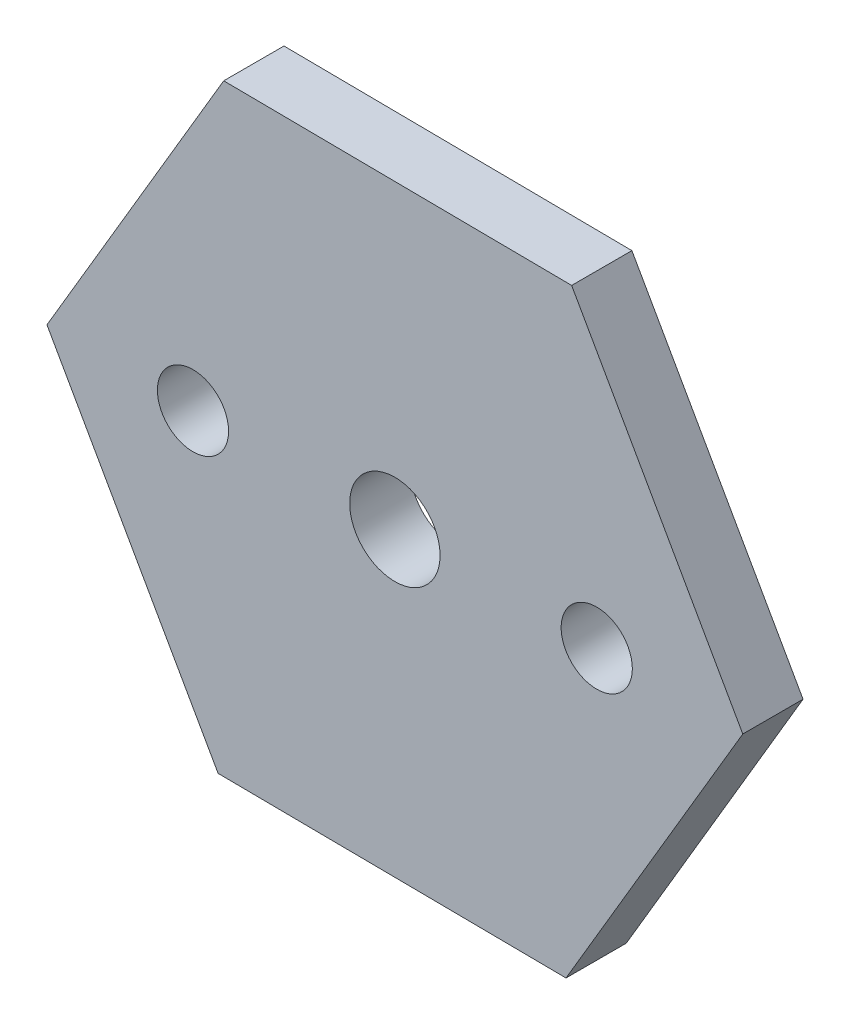
ISO-10303-21;
HEADER;
FILE_DESCRIPTION(('STEP AP214'),'2;1');
FILE_NAME('part.step','',(''),(''),'','','');
FILE_SCHEMA(('AUTOMOTIVE_DESIGN { 1 0 10303 214 1 1 1 1 }'));
ENDSEC;
DATA;
#1=APPLICATION_CONTEXT('core data for automotive mechanical design processes');
#2=APPLICATION_PROTOCOL_DEFINITION('international standard','automotive_design',2000,#1);
#3=PRODUCT_CONTEXT('',#1,'mechanical');
#4=PRODUCT('Part','Part','',(#3));
#5=PRODUCT_RELATED_PRODUCT_CATEGORY('part','',(#4));
#6=PRODUCT_DEFINITION_FORMATION('','',#4);
#7=PRODUCT_DEFINITION_CONTEXT('part definition',#1,'design');
#8=PRODUCT_DEFINITION('design','',#6,#7);
#9=PRODUCT_DEFINITION_SHAPE('','',#8);
#10=(LENGTH_UNIT() NAMED_UNIT(*) SI_UNIT(.MILLI.,.METRE.));
#11=(NAMED_UNIT(*) PLANE_ANGLE_UNIT() SI_UNIT($,.RADIAN.));
#12=(NAMED_UNIT(*) SI_UNIT($,.STERADIAN.) SOLID_ANGLE_UNIT());
#13=UNCERTAINTY_MEASURE_WITH_UNIT(LENGTH_MEASURE(1.E-05),#10,'distance_accuracy_value','');
#14=(GEOMETRIC_REPRESENTATION_CONTEXT(3) GLOBAL_UNCERTAINTY_ASSIGNED_CONTEXT((#13)) GLOBAL_UNIT_ASSIGNED_CONTEXT((#10,
#11,#12)) REPRESENTATION_CONTEXT('',''));
#15=CARTESIAN_POINT('',(0.,0.,0.));
#16=DIRECTION('',(0.,0.,1.));
#17=DIRECTION('',(1.,0.,0.));
#18=AXIS2_PLACEMENT_3D('',#15,#16,#17);
#19=CARTESIAN_POINT('',(0.,0.,2.54));
#20=DIRECTION('',(0.,0.,1.));
#21=DIRECTION('',(1.,0.,0.));
#22=AXIS2_PLACEMENT_3D('',#19,#20,#21);
#23=PLANE('',#22);
#24=CARTESIAN_POINT('',(8.509,-0.0794223138289076,2.54));
#25=DIRECTION('',(0.,0.,1.));
#26=DIRECTION('',(1.,0.,0.));
#27=AXIS2_PLACEMENT_3D('',#24,#25,#26);
#28=CIRCLE('',#27,1.5);
#29=CARTESIAN_POINT('',(10.009,-0.0794223138289076,2.54));
#30=VERTEX_POINT('',#29);
#31=EDGE_CURVE('E207',#30,#30,#28,.T.);
#32=ORIENTED_EDGE('',*,*,#31,.F.);
#33=EDGE_LOOP('',(#32));
#34=FACE_BOUND('',#33,.T.);
#35=DIRECTION('',(-0.999956441827415,0.00933351208579806,0.));
#36=VECTOR('',#35,1.);
#37=CARTESIAN_POINT('',(7.45056463850001,12.6310102486249,2.54));
#38=LINE('',#37,#36);
#39=CARTESIAN_POINT('',(7.45056463850001,12.6310102486249,2.54));
#40=VERTEX_POINT('',#39);
#41=CARTESIAN_POINT('',(-7.21349343152074,12.7678833737915,2.54));
#42=VERTEX_POINT('',#41);
#43=EDGE_CURVE('E146',#40,#42,#38,.T.);
#44=ORIENTED_EDGE('',*,*,#43,.T.);
#45=DIRECTION('',(-0.508061279486537,-0.861320925257539,0.));
#46=VECTOR('',#45,1.);
#47=CARTESIAN_POINT('',(-7.21349343152074,12.7678833737915,2.54));
#48=LINE('',#47,#46);
#49=CARTESIAN_POINT('',(-14.6640580700207,0.136873125166591,2.54));
#50=VERTEX_POINT('',#49);
#51=EDGE_CURVE('E94',#42,#50,#48,.T.);
#52=ORIENTED_EDGE('',*,*,#51,.T.);
#53=DIRECTION('',(0.491895162340877,-0.870654437343337,0.));
#54=VECTOR('',#53,1.);
#55=CARTESIAN_POINT('',(-14.6640580700207,0.136873125166591,2.54));
#56=LINE('',#55,#54);
#57=CARTESIAN_POINT('',(-7.45056463850001,-12.6310102486249,2.54));
#58=VERTEX_POINT('',#57);
#59=EDGE_CURVE('E107',#50,#58,#56,.T.);
#60=ORIENTED_EDGE('',*,*,#59,.T.);
#61=DIRECTION('',(0.999956441827415,-0.0093335120857989,0.));
#62=VECTOR('',#61,1.);
#63=CARTESIAN_POINT('',(-7.45056463850001,-12.6310102486249,2.54));
#64=LINE('',#63,#62);
#65=CARTESIAN_POINT('',(7.21349343152073,-12.7678833737915,2.54));
#66=VERTEX_POINT('',#65);
#67=EDGE_CURVE('E101',#58,#66,#64,.T.);
#68=ORIENTED_EDGE('',*,*,#67,.T.);
#69=DIRECTION('',(0.508061279486538,0.861320925257538,0.));
#70=VECTOR('',#69,1.);
#71=CARTESIAN_POINT('',(7.21349343152073,-12.7678833737915,2.54));
#72=LINE('',#71,#70);
#73=CARTESIAN_POINT('',(14.6640580700207,-0.136873125166595,2.54));
#74=VERTEX_POINT('',#73);
#75=EDGE_CURVE('E105',#66,#74,#72,.T.);
#76=ORIENTED_EDGE('',*,*,#75,.T.);
#77=DIRECTION('',(-0.491895162340877,0.870654437343337,0.));
#78=VECTOR('',#77,1.);
#79=CARTESIAN_POINT('',(14.6640580700207,-0.136873125166595,2.54));
#80=LINE('',#79,#78);
#81=EDGE_CURVE('E57',#74,#40,#80,.T.);
#82=ORIENTED_EDGE('',*,*,#81,.T.);
#83=EDGE_LOOP('',(#44,#52,#60,#68,#76,#82));
#84=FACE_BOUND('',#83,.T.);
#85=CARTESIAN_POINT('',(-8.509,0.079422313828912,2.54));
#86=DIRECTION('',(0.,0.,1.));
#87=DIRECTION('',(1.,0.,0.));
#88=AXIS2_PLACEMENT_3D('',#85,#86,#87);
#89=CIRCLE('',#88,1.5);
#90=CARTESIAN_POINT('',(-7.009,0.079422313828912,2.54));
#91=VERTEX_POINT('',#90);
#92=EDGE_CURVE('E134',#91,#91,#89,.T.);
#93=ORIENTED_EDGE('',*,*,#92,.F.);
#94=EDGE_LOOP('',(#93));
#95=FACE_BOUND('',#94,.T.);
#96=CARTESIAN_POINT('',(0.,0.,2.54));
#97=DIRECTION('',(0.,0.,1.));
#98=DIRECTION('',(1.,0.,0.));
#99=AXIS2_PLACEMENT_3D('',#96,#97,#98);
#100=CIRCLE('',#99,1.905);
#101=CARTESIAN_POINT('',(1.905,0.,2.54));
#102=VERTEX_POINT('',#101);
#103=EDGE_CURVE('E196',#102,#102,#100,.T.);
#104=ORIENTED_EDGE('',*,*,#103,.F.);
#105=EDGE_LOOP('',(#104));
#106=FACE_BOUND('',#105,.T.);
#107=ADVANCED_FACE('F39',(#34,#84,#95,#106),#23,.T.);
#108=CARTESIAN_POINT('',(0.,0.,0.));
#109=DIRECTION('',(0.,0.,1.));
#110=DIRECTION('',(1.,0.,0.));
#111=AXIS2_PLACEMENT_3D('',#108,#109,#110);
#112=PLANE('',#111);
#113=DIRECTION('',(-0.999956441827415,0.00933351208579806,0.));
#114=VECTOR('',#113,1.);
#115=CARTESIAN_POINT('',(7.45056463850001,12.6310102486249,0.));
#116=LINE('',#115,#114);
#117=CARTESIAN_POINT('',(7.45056463850001,12.6310102486249,0.));
#118=VERTEX_POINT('',#117);
#119=CARTESIAN_POINT('',(-7.21349343152074,12.7678833737915,0.));
#120=VERTEX_POINT('',#119);
#121=EDGE_CURVE('E129',#118,#120,#116,.T.);
#122=ORIENTED_EDGE('',*,*,#121,.F.);
#123=DIRECTION('',(-0.491895162340877,0.870654437343337,0.));
#124=VECTOR('',#123,1.);
#125=CARTESIAN_POINT('',(14.6640580700207,-0.136873125166595,0.));
#126=LINE('',#125,#124);
#127=CARTESIAN_POINT('',(14.6640580700207,-0.136873125166595,0.));
#128=VERTEX_POINT('',#127);
#129=EDGE_CURVE('E86',#128,#118,#126,.T.);
#130=ORIENTED_EDGE('',*,*,#129,.F.);
#131=DIRECTION('',(0.508061279486538,0.861320925257538,0.));
#132=VECTOR('',#131,1.);
#133=CARTESIAN_POINT('',(7.21349343152073,-12.7678833737915,0.));
#134=LINE('',#133,#132);
#135=CARTESIAN_POINT('',(7.21349343152073,-12.7678833737915,0.));
#136=VERTEX_POINT('',#135);
#137=EDGE_CURVE('E80',#136,#128,#134,.T.);
#138=ORIENTED_EDGE('',*,*,#137,.F.);
#139=DIRECTION('',(0.999956441827415,-0.0093335120857989,0.));
#140=VECTOR('',#139,1.);
#141=CARTESIAN_POINT('',(-7.45056463850001,-12.6310102486249,0.));
#142=LINE('',#141,#140);
#143=CARTESIAN_POINT('',(-7.45056463850001,-12.6310102486249,0.));
#144=VERTEX_POINT('',#143);
#145=EDGE_CURVE('E116',#144,#136,#142,.T.);
#146=ORIENTED_EDGE('',*,*,#145,.F.);
#147=DIRECTION('',(0.491895162340877,-0.870654437343337,0.));
#148=VECTOR('',#147,1.);
#149=CARTESIAN_POINT('',(-14.6640580700207,0.136873125166591,0.));
#150=LINE('',#149,#148);
#151=CARTESIAN_POINT('',(-14.6640580700207,0.136873125166591,0.));
#152=VERTEX_POINT('',#151);
#153=EDGE_CURVE('E137',#152,#144,#150,.T.);
#154=ORIENTED_EDGE('',*,*,#153,.F.);
#155=DIRECTION('',(-0.508061279486537,-0.861320925257539,0.));
#156=VECTOR('',#155,1.);
#157=CARTESIAN_POINT('',(-7.21349343152074,12.7678833737915,0.));
#158=LINE('',#157,#156);
#159=EDGE_CURVE('E133',#120,#152,#158,.T.);
#160=ORIENTED_EDGE('',*,*,#159,.F.);
#161=EDGE_LOOP('',(#122,#130,#138,#146,#154,#160));
#162=FACE_BOUND('',#161,.T.);
#163=CARTESIAN_POINT('',(-8.509,0.079422313828912,0.));
#164=DIRECTION('',(0.,0.,1.));
#165=DIRECTION('',(1.,0.,0.));
#166=AXIS2_PLACEMENT_3D('',#163,#164,#165);
#167=CIRCLE('',#166,1.5);
#168=CARTESIAN_POINT('',(-7.009,0.079422313828912,0.));
#169=VERTEX_POINT('',#168);
#170=EDGE_CURVE('E211',#169,#169,#167,.T.);
#171=ORIENTED_EDGE('',*,*,#170,.T.);
#172=EDGE_LOOP('',(#171));
#173=FACE_BOUND('',#172,.T.);
#174=CARTESIAN_POINT('',(8.509,-0.0794223138289076,0.));
#175=DIRECTION('',(0.,0.,1.));
#176=DIRECTION('',(1.,0.,0.));
#177=AXIS2_PLACEMENT_3D('',#174,#175,#176);
#178=CIRCLE('',#177,1.5);
#179=CARTESIAN_POINT('',(10.009,-0.0794223138289076,0.));
#180=VERTEX_POINT('',#179);
#181=EDGE_CURVE('E204',#180,#180,#178,.T.);
#182=ORIENTED_EDGE('',*,*,#181,.T.);
#183=EDGE_LOOP('',(#182));
#184=FACE_BOUND('',#183,.T.);
#185=CARTESIAN_POINT('',(0.,0.,0.));
#186=DIRECTION('',(0.,0.,1.));
#187=DIRECTION('',(1.,0.,0.));
#188=AXIS2_PLACEMENT_3D('',#185,#186,#187);
#189=CIRCLE('',#188,1.905);
#190=CARTESIAN_POINT('',(1.905,0.,0.));
#191=VERTEX_POINT('',#190);
#192=EDGE_CURVE('E199',#191,#191,#189,.T.);
#193=ORIENTED_EDGE('',*,*,#192,.T.);
#194=EDGE_LOOP('',(#193));
#195=FACE_BOUND('',#194,.T.);
#196=ADVANCED_FACE('F159',(#162,#173,#184,#195),#112,.F.);
#197=CARTESIAN_POINT('',(7.45056463850001,12.6310102486249,2.54));
#198=DIRECTION('',(-0.00933351208579806,-0.999956441827415,0.));
#199=DIRECTION('',(0.999956441827415,-0.00933351208579806,0.));
#200=AXIS2_PLACEMENT_3D('',#197,#198,#199);
#201=PLANE('',#200);
#202=ORIENTED_EDGE('',*,*,#121,.T.);
#203=DIRECTION('',(0.,0.,-1.));
#204=VECTOR('',#203,1.);
#205=CARTESIAN_POINT('',(-7.21349343152074,12.7678833737915,2.54));
#206=LINE('',#205,#204);
#207=EDGE_CURVE('E11',#42,#120,#206,.T.);
#208=ORIENTED_EDGE('',*,*,#207,.F.);
#209=ORIENTED_EDGE('',*,*,#43,.F.);
#210=DIRECTION('',(0.,0.,-1.));
#211=VECTOR('',#210,1.);
#212=CARTESIAN_POINT('',(7.45056463850001,12.6310102486249,2.54));
#213=LINE('',#212,#211);
#214=EDGE_CURVE('E125',#40,#118,#213,.T.);
#215=ORIENTED_EDGE('',*,*,#214,.T.);
#216=EDGE_LOOP('',(#202,#208,#209,#215));
#217=FACE_BOUND('',#216,.T.);
#218=ADVANCED_FACE('F41',(#217),#201,.F.);
#219=CARTESIAN_POINT('',(-7.21349343152074,12.7678833737915,2.54));
#220=DIRECTION('',(0.861320925257539,-0.508061279486537,0.));
#221=DIRECTION('',(0.508061279486537,0.861320925257539,0.));
#222=AXIS2_PLACEMENT_3D('',#219,#220,#221);
#223=PLANE('',#222);
#224=ORIENTED_EDGE('',*,*,#159,.T.);
#225=DIRECTION('',(0.,0.,-1.));
#226=VECTOR('',#225,1.);
#227=CARTESIAN_POINT('',(-14.6640580700207,0.136873125166591,2.54));
#228=LINE('',#227,#226);
#229=EDGE_CURVE('E49',#50,#152,#228,.T.);
#230=ORIENTED_EDGE('',*,*,#229,.F.);
#231=ORIENTED_EDGE('',*,*,#51,.F.);
#232=ORIENTED_EDGE('',*,*,#207,.T.);
#233=EDGE_LOOP('',(#224,#230,#231,#232));
#234=FACE_BOUND('',#233,.T.);
#235=ADVANCED_FACE('F267',(#234),#223,.F.);
#236=CARTESIAN_POINT('',(-14.6640580700207,0.136873125166591,2.54));
#237=DIRECTION('',(0.870654437343337,0.491895162340877,0.));
#238=DIRECTION('',(-0.491895162340877,0.870654437343337,0.));
#239=AXIS2_PLACEMENT_3D('',#236,#237,#238);
#240=PLANE('',#239);
#241=ORIENTED_EDGE('',*,*,#153,.T.);
#242=DIRECTION('',(0.,0.,-1.));
#243=VECTOR('',#242,1.);
#244=CARTESIAN_POINT('',(-7.45056463850001,-12.6310102486249,2.54));
#245=LINE('',#244,#243);
#246=EDGE_CURVE('E118',#58,#144,#245,.T.);
#247=ORIENTED_EDGE('',*,*,#246,.F.);
#248=ORIENTED_EDGE('',*,*,#59,.F.);
#249=ORIENTED_EDGE('',*,*,#229,.T.);
#250=EDGE_LOOP('',(#241,#247,#248,#249));
#251=FACE_BOUND('',#250,.T.);
#252=ADVANCED_FACE('F156',(#251),#240,.F.);
#253=CARTESIAN_POINT('',(-7.45056463850001,-12.6310102486249,2.54));
#254=DIRECTION('',(0.0093335120857989,0.999956441827415,0.));
#255=DIRECTION('',(-0.999956441827415,0.0093335120857989,0.));
#256=AXIS2_PLACEMENT_3D('',#253,#254,#255);
#257=PLANE('',#256);
#258=ORIENTED_EDGE('',*,*,#145,.T.);
#259=DIRECTION('',(0.,0.,-1.));
#260=VECTOR('',#259,1.);
#261=CARTESIAN_POINT('',(7.21349343152073,-12.7678833737915,2.54));
#262=LINE('',#261,#260);
#263=EDGE_CURVE('E113',#66,#136,#262,.T.);
#264=ORIENTED_EDGE('',*,*,#263,.F.);
#265=ORIENTED_EDGE('',*,*,#67,.F.);
#266=ORIENTED_EDGE('',*,*,#246,.T.);
#267=EDGE_LOOP('',(#258,#264,#265,#266));
#268=FACE_BOUND('',#267,.T.);
#269=ADVANCED_FACE('F114',(#268),#257,.F.);
#270=CARTESIAN_POINT('',(7.21349343152073,-12.7678833737915,2.54));
#271=DIRECTION('',(-0.861320925257538,0.508061279486538,0.));
#272=DIRECTION('',(-0.508061279486538,-0.861320925257538,0.));
#273=AXIS2_PLACEMENT_3D('',#270,#271,#272);
#274=PLANE('',#273);
#275=ORIENTED_EDGE('',*,*,#137,.T.);
#276=DIRECTION('',(0.,0.,-1.));
#277=VECTOR('',#276,1.);
#278=CARTESIAN_POINT('',(14.6640580700207,-0.136873125166595,2.54));
#279=LINE('',#278,#277);
#280=EDGE_CURVE('E119',#74,#128,#279,.T.);
#281=ORIENTED_EDGE('',*,*,#280,.F.);
#282=ORIENTED_EDGE('',*,*,#75,.F.);
#283=ORIENTED_EDGE('',*,*,#263,.T.);
#284=EDGE_LOOP('',(#275,#281,#282,#283));
#285=FACE_BOUND('',#284,.T.);
#286=ADVANCED_FACE('F121',(#285),#274,.F.);
#287=CARTESIAN_POINT('',(14.6640580700207,-0.136873125166595,2.54));
#288=DIRECTION('',(-0.870654437343337,-0.491895162340877,0.));
#289=DIRECTION('',(0.491895162340877,-0.870654437343337,0.));
#290=AXIS2_PLACEMENT_3D('',#287,#288,#289);
#291=PLANE('',#290);
#292=ORIENTED_EDGE('',*,*,#129,.T.);
#293=ORIENTED_EDGE('',*,*,#214,.F.);
#294=ORIENTED_EDGE('',*,*,#81,.F.);
#295=ORIENTED_EDGE('',*,*,#280,.T.);
#296=EDGE_LOOP('',(#292,#293,#294,#295));
#297=FACE_BOUND('',#296,.T.);
#298=ADVANCED_FACE('F164',(#297),#291,.F.);
#299=CARTESIAN_POINT('',(-8.509,0.079422313828912,2.54));
#300=DIRECTION('',(0.,0.,-1.));
#301=DIRECTION('',(-1.,0.,0.));
#302=AXIS2_PLACEMENT_3D('',#299,#300,#301);
#303=CYLINDRICAL_SURFACE('',#302,1.5);
#304=ORIENTED_EDGE('',*,*,#92,.T.);
#305=EDGE_LOOP('',(#304));
#306=FACE_BOUND('',#305,.T.);
#307=ORIENTED_EDGE('',*,*,#170,.F.);
#308=EDGE_LOOP('',(#307));
#309=FACE_BOUND('',#308,.T.);
#310=ADVANCED_FACE('F166',(#306,#309),#303,.F.);
#311=CARTESIAN_POINT('',(8.509,-0.0794223138289076,2.54));
#312=DIRECTION('',(0.,0.,-1.));
#313=DIRECTION('',(-1.,0.,0.));
#314=AXIS2_PLACEMENT_3D('',#311,#312,#313);
#315=CYLINDRICAL_SURFACE('',#314,1.5);
#316=ORIENTED_EDGE('',*,*,#31,.T.);
#317=EDGE_LOOP('',(#316));
#318=FACE_BOUND('',#317,.T.);
#319=ORIENTED_EDGE('',*,*,#181,.F.);
#320=EDGE_LOOP('',(#319));
#321=FACE_BOUND('',#320,.T.);
#322=ADVANCED_FACE('F172',(#318,#321),#315,.F.);
#323=CARTESIAN_POINT('',(0.,0.,2.54));
#324=DIRECTION('',(0.,0.,-1.));
#325=DIRECTION('',(-1.,0.,0.));
#326=AXIS2_PLACEMENT_3D('',#323,#324,#325);
#327=CYLINDRICAL_SURFACE('',#326,1.905);
#328=ORIENTED_EDGE('',*,*,#103,.T.);
#329=EDGE_LOOP('',(#328));
#330=FACE_BOUND('',#329,.T.);
#331=ORIENTED_EDGE('',*,*,#192,.F.);
#332=EDGE_LOOP('',(#331));
#333=FACE_BOUND('',#332,.T.);
#334=ADVANCED_FACE('F187',(#330,#333),#327,.F.);
#335=CLOSED_SHELL('',(#107,#196,#218,#235,#252,#269,#286,#298,#310,#322,#334));
#336=MANIFOLD_SOLID_BREP('B2',#335);
#337=ADVANCED_BREP_SHAPE_REPRESENTATION('',(#18,#336),#14);
#338=SHAPE_DEFINITION_REPRESENTATION(#9,#337);
ENDSEC;
END-ISO-10303-21;
